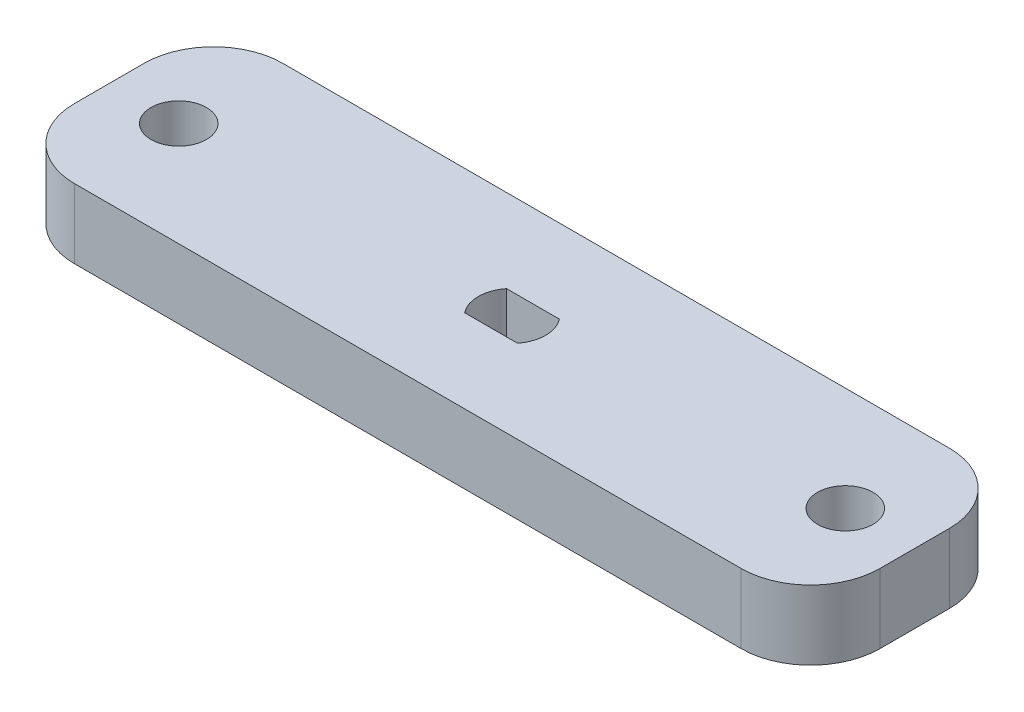
ISO-10303-21;
HEADER;
FILE_DESCRIPTION(('STEP AP214'),'2;1');
FILE_NAME('part.step','',(''),(''),'','','');
FILE_SCHEMA(('AUTOMOTIVE_DESIGN { 1 0 10303 214 1 1 1 1 }'));
ENDSEC;
DATA;
#1=APPLICATION_CONTEXT('core data for automotive mechanical design processes');
#2=APPLICATION_PROTOCOL_DEFINITION('international standard','automotive_design',2000,#1);
#3=PRODUCT_CONTEXT('',#1,'mechanical');
#4=PRODUCT('Part','Part','',(#3));
#5=PRODUCT_RELATED_PRODUCT_CATEGORY('part','',(#4));
#6=PRODUCT_DEFINITION_FORMATION('','',#4);
#7=PRODUCT_DEFINITION_CONTEXT('part definition',#1,'design');
#8=PRODUCT_DEFINITION('design','',#6,#7);
#9=PRODUCT_DEFINITION_SHAPE('','',#8);
#10=(LENGTH_UNIT() NAMED_UNIT(*) SI_UNIT(.MILLI.,.METRE.));
#11=(NAMED_UNIT(*) PLANE_ANGLE_UNIT() SI_UNIT($,.RADIAN.));
#12=(NAMED_UNIT(*) SI_UNIT($,.STERADIAN.) SOLID_ANGLE_UNIT());
#13=UNCERTAINTY_MEASURE_WITH_UNIT(LENGTH_MEASURE(1.E-05),#10,'distance_accuracy_value','');
#14=(GEOMETRIC_REPRESENTATION_CONTEXT(3) GLOBAL_UNCERTAINTY_ASSIGNED_CONTEXT((#13)) GLOBAL_UNIT_ASSIGNED_CONTEXT((#10,
#11,#12)) REPRESENTATION_CONTEXT('',''));
#15=CARTESIAN_POINT('',(0.,0.,0.));
#16=DIRECTION('',(0.,0.,1.));
#17=DIRECTION('',(1.,0.,0.));
#18=AXIS2_PLACEMENT_3D('',#15,#16,#17);
#19=CARTESIAN_POINT('',(0.,5.,0.));
#20=DIRECTION('',(0.,1.,0.));
#21=DIRECTION('',(0.,0.,1.));
#22=AXIS2_PLACEMENT_3D('',#19,#20,#21);
#23=PLANE('',#22);
#24=DIRECTION('',(-1.,0.,0.));
#25=VECTOR('',#24,1.);
#26=CARTESIAN_POINT('',(1.9,5.,-1.50685931659196));
#27=LINE('',#26,#25);
#28=CARTESIAN_POINT('',(1.9,5.,-1.50685931659196));
#29=VERTEX_POINT('',#28);
#30=CARTESIAN_POINT('',(-1.9,5.,-1.50685931659196));
#31=VERTEX_POINT('',#30);
#32=EDGE_CURVE('E133',#29,#31,#27,.T.);
#33=ORIENTED_EDGE('',*,*,#32,.F.);
#34=CARTESIAN_POINT('',(0.,5.,0.));
#35=DIRECTION('',(0.,1.,0.));
#36=DIRECTION('',(0.,0.,1.));
#37=AXIS2_PLACEMENT_3D('',#34,#35,#36);
#38=CIRCLE('',#37,2.425);
#39=CARTESIAN_POINT('',(1.9,5.,1.50685931659196));
#40=VERTEX_POINT('',#39);
#41=EDGE_CURVE('E123',#40,#29,#38,.T.);
#42=ORIENTED_EDGE('',*,*,#41,.F.);
#43=DIRECTION('',(1.,0.,0.));
#44=VECTOR('',#43,1.);
#45=CARTESIAN_POINT('',(1.9,5.,1.50685931659196));
#46=LINE('',#45,#44);
#47=CARTESIAN_POINT('',(-1.9,5.,1.50685931659196));
#48=VERTEX_POINT('',#47);
#49=EDGE_CURVE('E149',#48,#40,#46,.T.);
#50=ORIENTED_EDGE('',*,*,#49,.F.);
#51=CARTESIAN_POINT('',(0.,5.,0.));
#52=DIRECTION('',(0.,1.,0.));
#53=DIRECTION('',(0.,0.,1.));
#54=AXIS2_PLACEMENT_3D('',#51,#52,#53);
#55=CIRCLE('',#54,2.425);
#56=EDGE_CURVE('E147',#31,#48,#55,.T.);
#57=ORIENTED_EDGE('',*,*,#56,.F.);
#58=EDGE_LOOP('',(#33,#42,#50,#57));
#59=FACE_BOUND('',#58,.T.);
#60=CARTESIAN_POINT('',(24.,5.,0.));
#61=DIRECTION('',(0.,1.,0.));
#62=DIRECTION('',(0.,0.,1.));
#63=AXIS2_PLACEMENT_3D('',#60,#61,#62);
#64=CIRCLE('',#63,2.);
#65=CARTESIAN_POINT('',(24.,5.,2.));
#66=VERTEX_POINT('',#65);
#67=EDGE_CURVE('E167',#66,#66,#64,.T.);
#68=ORIENTED_EDGE('',*,*,#67,.F.);
#69=EDGE_LOOP('',(#68));
#70=FACE_BOUND('',#69,.T.);
#71=DIRECTION('',(1.,0.,0.));
#72=VECTOR('',#71,1.);
#73=CARTESIAN_POINT('',(29.,5.,7.5));
#74=LINE('',#73,#72);
#75=CARTESIAN_POINT('',(-24.,5.,7.5));
#76=VERTEX_POINT('',#75);
#77=CARTESIAN_POINT('',(24.,5.,7.5));
#78=VERTEX_POINT('',#77);
#79=EDGE_CURVE('E181',#76,#78,#74,.T.);
#80=ORIENTED_EDGE('',*,*,#79,.T.);
#81=CARTESIAN_POINT('',(24.,5.,2.5));
#82=DIRECTION('',(0.,1.,0.));
#83=DIRECTION('',(0.,0.,1.));
#84=AXIS2_PLACEMENT_3D('',#81,#82,#83);
#85=CIRCLE('',#84,5.);
#86=CARTESIAN_POINT('',(29.,5.,2.5));
#87=VERTEX_POINT('',#86);
#88=EDGE_CURVE('E216',#78,#87,#85,.T.);
#89=ORIENTED_EDGE('',*,*,#88,.T.);
#90=DIRECTION('',(0.,0.,-1.));
#91=VECTOR('',#90,1.);
#92=CARTESIAN_POINT('',(29.,5.,7.5));
#93=LINE('',#92,#91);
#94=CARTESIAN_POINT('',(29.,5.,-2.5));
#95=VERTEX_POINT('',#94);
#96=EDGE_CURVE('E173',#87,#95,#93,.T.);
#97=ORIENTED_EDGE('',*,*,#96,.T.);
#98=CARTESIAN_POINT('',(24.,5.,-2.5));
#99=DIRECTION('',(0.,1.,0.));
#100=DIRECTION('',(0.,0.,1.));
#101=AXIS2_PLACEMENT_3D('',#98,#99,#100);
#102=CIRCLE('',#101,5.);
#103=CARTESIAN_POINT('',(24.,5.,-7.5));
#104=VERTEX_POINT('',#103);
#105=EDGE_CURVE('E211',#95,#104,#102,.T.);
#106=ORIENTED_EDGE('',*,*,#105,.T.);
#107=DIRECTION('',(-1.,0.,0.));
#108=VECTOR('',#107,1.);
#109=CARTESIAN_POINT('',(29.,5.,-7.5));
#110=LINE('',#109,#108);
#111=CARTESIAN_POINT('',(-24.,5.,-7.5));
#112=VERTEX_POINT('',#111);
#113=EDGE_CURVE('E176',#104,#112,#110,.T.);
#114=ORIENTED_EDGE('',*,*,#113,.T.);
#115=CARTESIAN_POINT('',(-24.,5.,-2.5));
#116=DIRECTION('',(0.,1.,0.));
#117=DIRECTION('',(0.,0.,1.));
#118=AXIS2_PLACEMENT_3D('',#115,#116,#117);
#119=CIRCLE('',#118,5.);
#120=CARTESIAN_POINT('',(-29.,5.,-2.5));
#121=VERTEX_POINT('',#120);
#122=EDGE_CURVE('E54',#112,#121,#119,.T.);
#123=ORIENTED_EDGE('',*,*,#122,.T.);
#124=DIRECTION('',(0.,0.,1.));
#125=VECTOR('',#124,1.);
#126=CARTESIAN_POINT('',(-29.,5.,7.5));
#127=LINE('',#126,#125);
#128=CARTESIAN_POINT('',(-29.,5.,2.5));
#129=VERTEX_POINT('',#128);
#130=EDGE_CURVE('E179',#121,#129,#127,.T.);
#131=ORIENTED_EDGE('',*,*,#130,.T.);
#132=CARTESIAN_POINT('',(-24.,5.,2.5));
#133=DIRECTION('',(0.,1.,0.));
#134=DIRECTION('',(0.,0.,1.));
#135=AXIS2_PLACEMENT_3D('',#132,#133,#134);
#136=CIRCLE('',#135,5.);
#137=EDGE_CURVE('E214',#129,#76,#136,.T.);
#138=ORIENTED_EDGE('',*,*,#137,.T.);
#139=EDGE_LOOP('',(#80,#89,#97,#106,#114,#123,#131,#138));
#140=FACE_BOUND('',#139,.T.);
#141=CARTESIAN_POINT('',(-24.,5.,0.));
#142=DIRECTION('',(0.,1.,0.));
#143=DIRECTION('',(0.,0.,-1.));
#144=AXIS2_PLACEMENT_3D('',#141,#142,#143);
#145=CIRCLE('',#144,2.);
#146=CARTESIAN_POINT('',(-24.,5.,-2.));
#147=VERTEX_POINT('',#146);
#148=EDGE_CURVE('E156',#147,#147,#145,.T.);
#149=ORIENTED_EDGE('',*,*,#148,.F.);
#150=EDGE_LOOP('',(#149));
#151=FACE_BOUND('',#150,.T.);
#152=ADVANCED_FACE('F32',(#59,#70,#140,#151),#23,.T.);
#153=CARTESIAN_POINT('',(0.,0.,0.));
#154=DIRECTION('',(0.,1.,0.));
#155=DIRECTION('',(0.,0.,1.));
#156=AXIS2_PLACEMENT_3D('',#153,#154,#155);
#157=PLANE('',#156);
#158=CARTESIAN_POINT('',(24.,0.,0.));
#159=DIRECTION('',(0.,1.,0.));
#160=DIRECTION('',(0.,0.,1.));
#161=AXIS2_PLACEMENT_3D('',#158,#159,#160);
#162=CIRCLE('',#161,2.);
#163=CARTESIAN_POINT('',(24.,0.,2.));
#164=VERTEX_POINT('',#163);
#165=EDGE_CURVE('E141',#164,#164,#162,.T.);
#166=ORIENTED_EDGE('',*,*,#165,.T.);
#167=EDGE_LOOP('',(#166));
#168=FACE_BOUND('',#167,.T.);
#169=DIRECTION('',(0.,0.,-1.));
#170=VECTOR('',#169,1.);
#171=CARTESIAN_POINT('',(29.,0.,7.5));
#172=LINE('',#171,#170);
#173=CARTESIAN_POINT('',(29.,0.,2.5));
#174=VERTEX_POINT('',#173);
#175=CARTESIAN_POINT('',(29.,0.,-2.5));
#176=VERTEX_POINT('',#175);
#177=EDGE_CURVE('E170',#174,#176,#172,.T.);
#178=ORIENTED_EDGE('',*,*,#177,.F.);
#179=CARTESIAN_POINT('',(24.,0.,2.5));
#180=DIRECTION('',(0.,1.,0.));
#181=DIRECTION('',(0.,0.,1.));
#182=AXIS2_PLACEMENT_3D('',#179,#180,#181);
#183=CIRCLE('',#182,5.);
#184=CARTESIAN_POINT('',(24.,0.,7.5));
#185=VERTEX_POINT('',#184);
#186=EDGE_CURVE('E204',#174,#185,#183,.F.);
#187=ORIENTED_EDGE('',*,*,#186,.T.);
#188=DIRECTION('',(1.,0.,0.));
#189=VECTOR('',#188,1.);
#190=CARTESIAN_POINT('',(29.,0.,7.5));
#191=LINE('',#190,#189);
#192=CARTESIAN_POINT('',(-24.,0.,7.5));
#193=VERTEX_POINT('',#192);
#194=EDGE_CURVE('E177',#193,#185,#191,.T.);
#195=ORIENTED_EDGE('',*,*,#194,.F.);
#196=CARTESIAN_POINT('',(-24.,0.,2.5));
#197=DIRECTION('',(0.,1.,0.));
#198=DIRECTION('',(0.,0.,1.));
#199=AXIS2_PLACEMENT_3D('',#196,#197,#198);
#200=CIRCLE('',#199,5.);
#201=CARTESIAN_POINT('',(-29.,0.,2.5));
#202=VERTEX_POINT('',#201);
#203=EDGE_CURVE('E202',#193,#202,#200,.F.);
#204=ORIENTED_EDGE('',*,*,#203,.T.);
#205=DIRECTION('',(0.,0.,1.));
#206=VECTOR('',#205,1.);
#207=CARTESIAN_POINT('',(-29.,0.,7.5));
#208=LINE('',#207,#206);
#209=CARTESIAN_POINT('',(-29.,0.,-2.5));
#210=VERTEX_POINT('',#209);
#211=EDGE_CURVE('E190',#210,#202,#208,.T.);
#212=ORIENTED_EDGE('',*,*,#211,.F.);
#213=CARTESIAN_POINT('',(-24.,0.,-2.5));
#214=DIRECTION('',(0.,1.,0.));
#215=DIRECTION('',(0.,0.,1.));
#216=AXIS2_PLACEMENT_3D('',#213,#214,#215);
#217=CIRCLE('',#216,5.);
#218=CARTESIAN_POINT('',(-24.,0.,-7.5));
#219=VERTEX_POINT('',#218);
#220=EDGE_CURVE('E200',#210,#219,#217,.F.);
#221=ORIENTED_EDGE('',*,*,#220,.T.);
#222=DIRECTION('',(-1.,0.,0.));
#223=VECTOR('',#222,1.);
#224=CARTESIAN_POINT('',(29.,0.,-7.5));
#225=LINE('',#224,#223);
#226=CARTESIAN_POINT('',(24.,0.,-7.5));
#227=VERTEX_POINT('',#226);
#228=EDGE_CURVE('E187',#227,#219,#225,.T.);
#229=ORIENTED_EDGE('',*,*,#228,.F.);
#230=CARTESIAN_POINT('',(24.,0.,-2.5));
#231=DIRECTION('',(0.,1.,0.));
#232=DIRECTION('',(0.,0.,1.));
#233=AXIS2_PLACEMENT_3D('',#230,#231,#232);
#234=CIRCLE('',#233,5.);
#235=EDGE_CURVE('E198',#227,#176,#234,.F.);
#236=ORIENTED_EDGE('',*,*,#235,.T.);
#237=EDGE_LOOP('',(#178,#187,#195,#204,#212,#221,#229,#236));
#238=FACE_BOUND('',#237,.T.);
#239=CARTESIAN_POINT('',(0.,0.,0.));
#240=DIRECTION('',(0.,1.,0.));
#241=DIRECTION('',(0.,0.,1.));
#242=AXIS2_PLACEMENT_3D('',#239,#240,#241);
#243=CIRCLE('',#242,2.425);
#244=CARTESIAN_POINT('',(1.9,0.,1.50685931659196));
#245=VERTEX_POINT('',#244);
#246=CARTESIAN_POINT('',(1.9,0.,-1.50685931659196));
#247=VERTEX_POINT('',#246);
#248=EDGE_CURVE('E154',#245,#247,#243,.T.);
#249=ORIENTED_EDGE('',*,*,#248,.T.);
#250=DIRECTION('',(-1.,0.,0.));
#251=VECTOR('',#250,1.);
#252=CARTESIAN_POINT('',(1.9,0.,-1.50685931659196));
#253=LINE('',#252,#251);
#254=CARTESIAN_POINT('',(-1.9,0.,-1.50685931659196));
#255=VERTEX_POINT('',#254);
#256=EDGE_CURVE('E140',#247,#255,#253,.T.);
#257=ORIENTED_EDGE('',*,*,#256,.T.);
#258=CARTESIAN_POINT('',(0.,0.,0.));
#259=DIRECTION('',(0.,1.,0.));
#260=DIRECTION('',(0.,0.,1.));
#261=AXIS2_PLACEMENT_3D('',#258,#259,#260);
#262=CIRCLE('',#261,2.425);
#263=CARTESIAN_POINT('',(-1.9,0.,1.50685931659196));
#264=VERTEX_POINT('',#263);
#265=EDGE_CURVE('E158',#255,#264,#262,.T.);
#266=ORIENTED_EDGE('',*,*,#265,.T.);
#267=DIRECTION('',(1.,0.,0.));
#268=VECTOR('',#267,1.);
#269=CARTESIAN_POINT('',(1.9,0.,1.50685931659196));
#270=LINE('',#269,#268);
#271=EDGE_CURVE('E134',#264,#245,#270,.T.);
#272=ORIENTED_EDGE('',*,*,#271,.T.);
#273=EDGE_LOOP('',(#249,#257,#266,#272));
#274=FACE_BOUND('',#273,.T.);
#275=CARTESIAN_POINT('',(-24.,0.,0.));
#276=DIRECTION('',(0.,1.,0.));
#277=DIRECTION('',(0.,0.,-1.));
#278=AXIS2_PLACEMENT_3D('',#275,#276,#277);
#279=CIRCLE('',#278,2.);
#280=CARTESIAN_POINT('',(-24.,0.,-2.));
#281=VERTEX_POINT('',#280);
#282=EDGE_CURVE('E400',#281,#281,#279,.T.);
#283=ORIENTED_EDGE('',*,*,#282,.T.);
#284=EDGE_LOOP('',(#283));
#285=FACE_BOUND('',#284,.T.);
#286=ADVANCED_FACE('F232',(#168,#238,#274,#285),#157,.F.);
#287=CARTESIAN_POINT('',(29.,5.,7.5));
#288=DIRECTION('',(-1.,0.,0.));
#289=DIRECTION('',(0.,0.,1.));
#290=AXIS2_PLACEMENT_3D('',#287,#288,#289);
#291=PLANE('',#290);
#292=ORIENTED_EDGE('',*,*,#96,.F.);
#293=DIRECTION('',(0.,-1.,0.));
#294=VECTOR('',#293,1.);
#295=CARTESIAN_POINT('',(29.,5.,2.5));
#296=LINE('',#295,#294);
#297=EDGE_CURVE('E195',#87,#174,#296,.T.);
#298=ORIENTED_EDGE('',*,*,#297,.T.);
#299=ORIENTED_EDGE('',*,*,#177,.T.);
#300=DIRECTION('',(0.,-1.,0.));
#301=VECTOR('',#300,1.);
#302=CARTESIAN_POINT('',(29.,5.,-2.5));
#303=LINE('',#302,#301);
#304=EDGE_CURVE('E184',#176,#95,#303,.F.);
#305=ORIENTED_EDGE('',*,*,#304,.T.);
#306=EDGE_LOOP('',(#292,#298,#299,#305));
#307=FACE_BOUND('',#306,.T.);
#308=ADVANCED_FACE('F255',(#307),#291,.F.);
#309=CARTESIAN_POINT('',(29.,5.,-7.5));
#310=DIRECTION('',(0.,0.,1.));
#311=DIRECTION('',(1.,0.,0.));
#312=AXIS2_PLACEMENT_3D('',#309,#310,#311);
#313=PLANE('',#312);
#314=ORIENTED_EDGE('',*,*,#228,.T.);
#315=DIRECTION('',(0.,-1.,0.));
#316=VECTOR('',#315,1.);
#317=CARTESIAN_POINT('',(-24.,5.,-7.5));
#318=LINE('',#317,#316);
#319=EDGE_CURVE('E11',#219,#112,#318,.F.);
#320=ORIENTED_EDGE('',*,*,#319,.T.);
#321=ORIENTED_EDGE('',*,*,#113,.F.);
#322=DIRECTION('',(0.,-1.,0.));
#323=VECTOR('',#322,1.);
#324=CARTESIAN_POINT('',(24.,5.,-7.5));
#325=LINE('',#324,#323);
#326=EDGE_CURVE('E40',#104,#227,#325,.T.);
#327=ORIENTED_EDGE('',*,*,#326,.T.);
#328=EDGE_LOOP('',(#314,#320,#321,#327));
#329=FACE_BOUND('',#328,.T.);
#330=ADVANCED_FACE('F226',(#329),#313,.F.);
#331=CARTESIAN_POINT('',(-29.,5.,7.5));
#332=DIRECTION('',(1.,0.,0.));
#333=DIRECTION('',(0.,0.,-1.));
#334=AXIS2_PLACEMENT_3D('',#331,#332,#333);
#335=PLANE('',#334);
#336=ORIENTED_EDGE('',*,*,#211,.T.);
#337=DIRECTION('',(0.,-1.,0.));
#338=VECTOR('',#337,1.);
#339=CARTESIAN_POINT('',(-29.,5.,2.5));
#340=LINE('',#339,#338);
#341=EDGE_CURVE('E47',#202,#129,#340,.F.);
#342=ORIENTED_EDGE('',*,*,#341,.T.);
#343=ORIENTED_EDGE('',*,*,#130,.F.);
#344=DIRECTION('',(0.,-1.,0.));
#345=VECTOR('',#344,1.);
#346=CARTESIAN_POINT('',(-29.,5.,-2.5));
#347=LINE('',#346,#345);
#348=EDGE_CURVE('E218',#121,#210,#347,.T.);
#349=ORIENTED_EDGE('',*,*,#348,.T.);
#350=EDGE_LOOP('',(#336,#342,#343,#349));
#351=FACE_BOUND('',#350,.T.);
#352=ADVANCED_FACE('F238',(#351),#335,.F.);
#353=CARTESIAN_POINT('',(29.,5.,7.5));
#354=DIRECTION('',(0.,0.,-1.));
#355=DIRECTION('',(-1.,0.,0.));
#356=AXIS2_PLACEMENT_3D('',#353,#354,#355);
#357=PLANE('',#356);
#358=ORIENTED_EDGE('',*,*,#194,.T.);
#359=DIRECTION('',(0.,-1.,0.));
#360=VECTOR('',#359,1.);
#361=CARTESIAN_POINT('',(24.,5.,7.5));
#362=LINE('',#361,#360);
#363=EDGE_CURVE('E209',#185,#78,#362,.F.);
#364=ORIENTED_EDGE('',*,*,#363,.T.);
#365=ORIENTED_EDGE('',*,*,#79,.F.);
#366=DIRECTION('',(0.,-1.,0.));
#367=VECTOR('',#366,1.);
#368=CARTESIAN_POINT('',(-24.,5.,7.5));
#369=LINE('',#368,#367);
#370=EDGE_CURVE('E206',#76,#193,#369,.T.);
#371=ORIENTED_EDGE('',*,*,#370,.T.);
#372=EDGE_LOOP('',(#358,#364,#365,#371));
#373=FACE_BOUND('',#372,.T.);
#374=ADVANCED_FACE('F247',(#373),#357,.F.);
#375=CARTESIAN_POINT('',(24.,5.,0.));
#376=DIRECTION('',(0.,-1.,0.));
#377=DIRECTION('',(0.,0.,-1.));
#378=AXIS2_PLACEMENT_3D('',#375,#376,#377);
#379=CYLINDRICAL_SURFACE('',#378,2.);
#380=ORIENTED_EDGE('',*,*,#67,.T.);
#381=EDGE_LOOP('',(#380));
#382=FACE_BOUND('',#381,.T.);
#383=ORIENTED_EDGE('',*,*,#165,.F.);
#384=EDGE_LOOP('',(#383));
#385=FACE_BOUND('',#384,.T.);
#386=ADVANCED_FACE('F269',(#382,#385),#379,.F.);
#387=CARTESIAN_POINT('',(0.,5.,0.));
#388=DIRECTION('',(0.,-1.,0.));
#389=DIRECTION('',(0.,0.,-1.));
#390=AXIS2_PLACEMENT_3D('',#387,#388,#389);
#391=CYLINDRICAL_SURFACE('',#390,2.425);
#392=ORIENTED_EDGE('',*,*,#248,.F.);
#393=DIRECTION('',(0.,-1.,0.));
#394=VECTOR('',#393,1.);
#395=CARTESIAN_POINT('',(1.9,5.,1.50685931659196));
#396=LINE('',#395,#394);
#397=EDGE_CURVE('E129',#40,#245,#396,.T.);
#398=ORIENTED_EDGE('',*,*,#397,.F.);
#399=ORIENTED_EDGE('',*,*,#41,.T.);
#400=DIRECTION('',(0.,-1.,0.));
#401=VECTOR('',#400,1.);
#402=CARTESIAN_POINT('',(1.9,5.,-1.50685931659196));
#403=LINE('',#402,#401);
#404=EDGE_CURVE('E126',#29,#247,#403,.T.);
#405=ORIENTED_EDGE('',*,*,#404,.T.);
#406=EDGE_LOOP('',(#392,#398,#399,#405));
#407=FACE_BOUND('',#406,.T.);
#408=ADVANCED_FACE('F125',(#407),#391,.F.);
#409=CARTESIAN_POINT('',(1.9,5.,-1.50685931659196));
#410=DIRECTION('',(0.,0.,1.));
#411=DIRECTION('',(1.,0.,0.));
#412=AXIS2_PLACEMENT_3D('',#409,#410,#411);
#413=PLANE('',#412);
#414=ORIENTED_EDGE('',*,*,#256,.F.);
#415=ORIENTED_EDGE('',*,*,#404,.F.);
#416=ORIENTED_EDGE('',*,*,#32,.T.);
#417=DIRECTION('',(0.,-1.,0.));
#418=VECTOR('',#417,1.);
#419=CARTESIAN_POINT('',(-1.9,5.,-1.50685931659196));
#420=LINE('',#419,#418);
#421=EDGE_CURVE('E142',#31,#255,#420,.T.);
#422=ORIENTED_EDGE('',*,*,#421,.T.);
#423=EDGE_LOOP('',(#414,#415,#416,#422));
#424=FACE_BOUND('',#423,.T.);
#425=ADVANCED_FACE('F137',(#424),#413,.T.);
#426=CARTESIAN_POINT('',(0.,5.,0.));
#427=DIRECTION('',(0.,-1.,0.));
#428=DIRECTION('',(0.,0.,-1.));
#429=AXIS2_PLACEMENT_3D('',#426,#427,#428);
#430=CYLINDRICAL_SURFACE('',#429,2.425);
#431=ORIENTED_EDGE('',*,*,#265,.F.);
#432=ORIENTED_EDGE('',*,*,#421,.F.);
#433=ORIENTED_EDGE('',*,*,#56,.T.);
#434=DIRECTION('',(0.,-1.,0.));
#435=VECTOR('',#434,1.);
#436=CARTESIAN_POINT('',(-1.9,5.,1.50685931659196));
#437=LINE('',#436,#435);
#438=EDGE_CURVE('E164',#48,#264,#437,.T.);
#439=ORIENTED_EDGE('',*,*,#438,.T.);
#440=EDGE_LOOP('',(#431,#432,#433,#439));
#441=FACE_BOUND('',#440,.T.);
#442=ADVANCED_FACE('F322',(#441),#430,.F.);
#443=CARTESIAN_POINT('',(1.9,5.,1.50685931659196));
#444=DIRECTION('',(0.,0.,-1.));
#445=DIRECTION('',(-1.,0.,0.));
#446=AXIS2_PLACEMENT_3D('',#443,#444,#445);
#447=PLANE('',#446);
#448=ORIENTED_EDGE('',*,*,#271,.F.);
#449=ORIENTED_EDGE('',*,*,#438,.F.);
#450=ORIENTED_EDGE('',*,*,#49,.T.);
#451=ORIENTED_EDGE('',*,*,#397,.T.);
#452=EDGE_LOOP('',(#448,#449,#450,#451));
#453=FACE_BOUND('',#452,.T.);
#454=ADVANCED_FACE('F313',(#453),#447,.T.);
#455=CARTESIAN_POINT('',(-24.,5.,0.));
#456=DIRECTION('',(0.,-1.,0.));
#457=DIRECTION('',(0.,0.,-1.));
#458=AXIS2_PLACEMENT_3D('',#455,#456,#457);
#459=CYLINDRICAL_SURFACE('',#458,2.);
#460=ORIENTED_EDGE('',*,*,#148,.T.);
#461=EDGE_LOOP('',(#460));
#462=FACE_BOUND('',#461,.T.);
#463=ORIENTED_EDGE('',*,*,#282,.F.);
#464=EDGE_LOOP('',(#463));
#465=FACE_BOUND('',#464,.T.);
#466=ADVANCED_FACE('F282',(#462,#465),#459,.F.);
#467=CARTESIAN_POINT('',(24.,5.,2.5));
#468=DIRECTION('',(0.,-1.,0.));
#469=DIRECTION('',(0.,0.,-1.));
#470=AXIS2_PLACEMENT_3D('',#467,#468,#469);
#471=CYLINDRICAL_SURFACE('',#470,5.);
#472=ORIENTED_EDGE('',*,*,#88,.F.);
#473=ORIENTED_EDGE('',*,*,#363,.F.);
#474=ORIENTED_EDGE('',*,*,#186,.F.);
#475=ORIENTED_EDGE('',*,*,#297,.F.);
#476=EDGE_LOOP('',(#472,#473,#474,#475));
#477=FACE_BOUND('',#476,.T.);
#478=ADVANCED_FACE('F252',(#477),#471,.T.);
#479=CARTESIAN_POINT('',(-24.,5.,2.5));
#480=DIRECTION('',(0.,-1.,0.));
#481=DIRECTION('',(0.,0.,-1.));
#482=AXIS2_PLACEMENT_3D('',#479,#480,#481);
#483=CYLINDRICAL_SURFACE('',#482,5.);
#484=ORIENTED_EDGE('',*,*,#137,.F.);
#485=ORIENTED_EDGE('',*,*,#341,.F.);
#486=ORIENTED_EDGE('',*,*,#203,.F.);
#487=ORIENTED_EDGE('',*,*,#370,.F.);
#488=EDGE_LOOP('',(#484,#485,#486,#487));
#489=FACE_BOUND('',#488,.T.);
#490=ADVANCED_FACE('F244',(#489),#483,.T.);
#491=CARTESIAN_POINT('',(-24.,5.,-2.5));
#492=DIRECTION('',(0.,-1.,0.));
#493=DIRECTION('',(0.,0.,-1.));
#494=AXIS2_PLACEMENT_3D('',#491,#492,#493);
#495=CYLINDRICAL_SURFACE('',#494,5.);
#496=ORIENTED_EDGE('',*,*,#122,.F.);
#497=ORIENTED_EDGE('',*,*,#319,.F.);
#498=ORIENTED_EDGE('',*,*,#220,.F.);
#499=ORIENTED_EDGE('',*,*,#348,.F.);
#500=EDGE_LOOP('',(#496,#497,#498,#499));
#501=FACE_BOUND('',#500,.T.);
#502=ADVANCED_FACE('F237',(#501),#495,.T.);
#503=CARTESIAN_POINT('',(24.,5.,-2.5));
#504=DIRECTION('',(0.,-1.,0.));
#505=DIRECTION('',(0.,0.,-1.));
#506=AXIS2_PLACEMENT_3D('',#503,#504,#505);
#507=CYLINDRICAL_SURFACE('',#506,5.);
#508=ORIENTED_EDGE('',*,*,#105,.F.);
#509=ORIENTED_EDGE('',*,*,#304,.F.);
#510=ORIENTED_EDGE('',*,*,#235,.F.);
#511=ORIENTED_EDGE('',*,*,#326,.F.);
#512=EDGE_LOOP('',(#508,#509,#510,#511));
#513=FACE_BOUND('',#512,.T.);
#514=ADVANCED_FACE('F34',(#513),#507,.T.);
#515=CLOSED_SHELL('',(#152,#286,#308,#330,#352,#374,#386,#408,#425,#442,#454,#466,#478,#490,
#502,#514));
#516=MANIFOLD_SOLID_BREP('B2',#515);
#517=ADVANCED_BREP_SHAPE_REPRESENTATION('',(#18,#516),#14);
#518=SHAPE_DEFINITION_REPRESENTATION(#9,#517);
ENDSEC;
END-ISO-10303-21;
